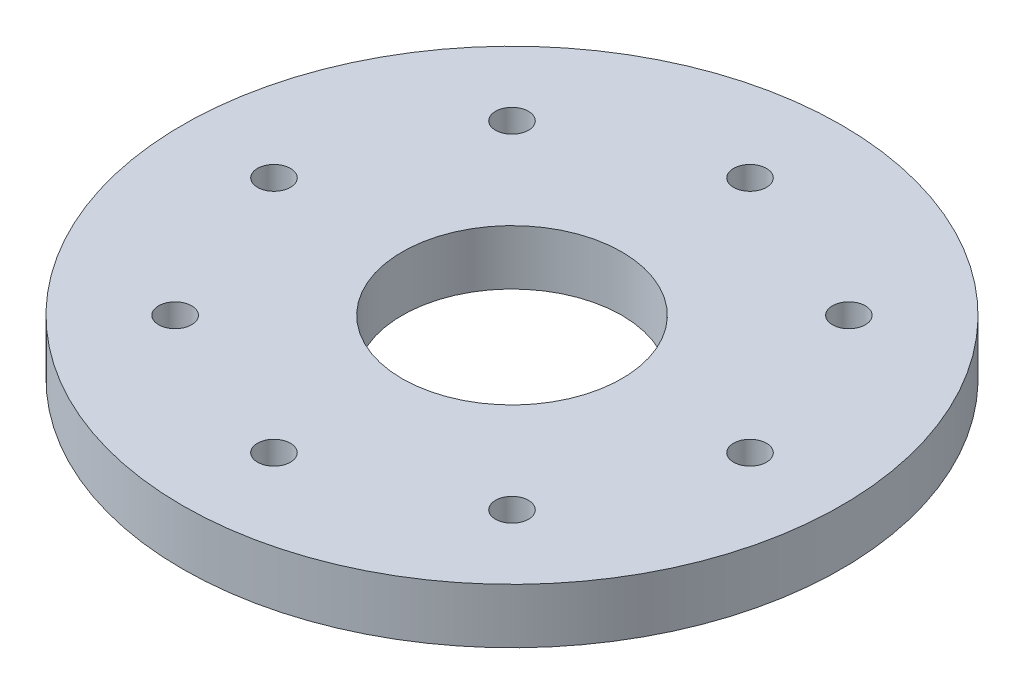
ISO-10303-21;
HEADER;
FILE_DESCRIPTION(('STEP AP214'),'2;1');
FILE_NAME('part.step','',(''),(''),'','','');
FILE_SCHEMA(('AUTOMOTIVE_DESIGN { 1 0 10303 214 1 1 1 1 }'));
ENDSEC;
DATA;
#1=APPLICATION_CONTEXT('core data for automotive mechanical design processes');
#2=APPLICATION_PROTOCOL_DEFINITION('international standard','automotive_design',2000,#1);
#3=PRODUCT_CONTEXT('',#1,'mechanical');
#4=PRODUCT('Part','Part','',(#3));
#5=PRODUCT_RELATED_PRODUCT_CATEGORY('part','',(#4));
#6=PRODUCT_DEFINITION_FORMATION('','',#4);
#7=PRODUCT_DEFINITION_CONTEXT('part definition',#1,'design');
#8=PRODUCT_DEFINITION('design','',#6,#7);
#9=PRODUCT_DEFINITION_SHAPE('','',#8);
#10=(LENGTH_UNIT() NAMED_UNIT(*) SI_UNIT(.MILLI.,.METRE.));
#11=(NAMED_UNIT(*) PLANE_ANGLE_UNIT() SI_UNIT($,.RADIAN.));
#12=(NAMED_UNIT(*) SI_UNIT($,.STERADIAN.) SOLID_ANGLE_UNIT());
#13=UNCERTAINTY_MEASURE_WITH_UNIT(LENGTH_MEASURE(1.E-05),#10,'distance_accuracy_value','');
#14=(GEOMETRIC_REPRESENTATION_CONTEXT(3) GLOBAL_UNCERTAINTY_ASSIGNED_CONTEXT((#13)) GLOBAL_UNIT_ASSIGNED_CONTEXT((#10,
#11,#12)) REPRESENTATION_CONTEXT('',''));
#15=CARTESIAN_POINT('',(0.,0.,0.));
#16=DIRECTION('',(0.,0.,1.));
#17=DIRECTION('',(1.,0.,0.));
#18=AXIS2_PLACEMENT_3D('',#15,#16,#17);
#19=CARTESIAN_POINT('',(0.,30.,0.));
#20=DIRECTION('',(0.,1.,0.));
#21=DIRECTION('',(0.,0.,1.));
#22=AXIS2_PLACEMENT_3D('',#19,#20,#21);
#23=PLANE('',#22);
#24=CARTESIAN_POINT('',(92.,30.,92.));
#25=DIRECTION('',(0.,1.,0.));
#26=DIRECTION('',(0.,0.,1.));
#27=AXIS2_PLACEMENT_3D('',#24,#25,#26);
#28=CIRCLE('',#27,8.99999999999999);
#29=CARTESIAN_POINT('',(92.,30.,101.));
#30=VERTEX_POINT('',#29);
#31=EDGE_CURVE('E87',#30,#30,#28,.T.);
#32=ORIENTED_EDGE('',*,*,#31,.F.);
#33=EDGE_LOOP('',(#32));
#34=FACE_BOUND('',#33,.T.);
#35=CARTESIAN_POINT('',(92.,30.,-92.));
#36=DIRECTION('',(0.,1.,0.));
#37=DIRECTION('',(0.,0.,1.));
#38=AXIS2_PLACEMENT_3D('',#35,#36,#37);
#39=CIRCLE('',#38,8.99999999999999);
#40=CARTESIAN_POINT('',(92.,30.,-83.));
#41=VERTEX_POINT('',#40);
#42=EDGE_CURVE('E75',#41,#41,#39,.T.);
#43=ORIENTED_EDGE('',*,*,#42,.F.);
#44=EDGE_LOOP('',(#43));
#45=FACE_BOUND('',#44,.T.);
#46=CARTESIAN_POINT('',(0.,30.,-130.));
#47=DIRECTION('',(0.,1.,0.));
#48=DIRECTION('',(0.,0.,1.));
#49=AXIS2_PLACEMENT_3D('',#46,#47,#48);
#50=CIRCLE('',#49,9.);
#51=CARTESIAN_POINT('',(0.,30.,-121.));
#52=VERTEX_POINT('',#51);
#53=EDGE_CURVE('E63',#52,#52,#50,.T.);
#54=ORIENTED_EDGE('',*,*,#53,.F.);
#55=EDGE_LOOP('',(#54));
#56=FACE_BOUND('',#55,.T.);
#57=CARTESIAN_POINT('',(130.,30.,0.));
#58=DIRECTION('',(0.,1.,0.));
#59=DIRECTION('',(0.,0.,1.));
#60=AXIS2_PLACEMENT_3D('',#57,#58,#59);
#61=CIRCLE('',#60,9.00000000000001);
#62=CARTESIAN_POINT('',(130.,30.,9.00000000000001));
#63=VERTEX_POINT('',#62);
#64=EDGE_CURVE('E51',#63,#63,#61,.T.);
#65=ORIENTED_EDGE('',*,*,#64,.F.);
#66=EDGE_LOOP('',(#65));
#67=FACE_BOUND('',#66,.T.);
#68=CARTESIAN_POINT('',(0.,30.,0.));
#69=DIRECTION('',(0.,1.,0.));
#70=DIRECTION('',(0.,0.,1.));
#71=AXIS2_PLACEMENT_3D('',#68,#69,#70);
#72=CIRCLE('',#71,180.);
#73=CARTESIAN_POINT('',(0.,30.,180.));
#74=VERTEX_POINT('',#73);
#75=EDGE_CURVE('E10',#74,#74,#72,.T.);
#76=ORIENTED_EDGE('',*,*,#75,.T.);
#77=EDGE_LOOP('',(#76));
#78=FACE_BOUND('',#77,.T.);
#79=CARTESIAN_POINT('',(0.,30.,0.));
#80=DIRECTION('',(0.,1.,0.));
#81=DIRECTION('',(0.,0.,1.));
#82=AXIS2_PLACEMENT_3D('',#79,#80,#81);
#83=CIRCLE('',#82,60.);
#84=CARTESIAN_POINT('',(0.,30.,60.));
#85=VERTEX_POINT('',#84);
#86=EDGE_CURVE('E46',#85,#85,#83,.T.);
#87=ORIENTED_EDGE('',*,*,#86,.F.);
#88=EDGE_LOOP('',(#87));
#89=FACE_BOUND('',#88,.T.);
#90=CARTESIAN_POINT('',(-130.,30.,0.));
#91=DIRECTION('',(0.,1.,0.));
#92=DIRECTION('',(0.,0.,1.));
#93=AXIS2_PLACEMENT_3D('',#90,#91,#92);
#94=CIRCLE('',#93,9.);
#95=CARTESIAN_POINT('',(-130.,30.,9.));
#96=VERTEX_POINT('',#95);
#97=EDGE_CURVE('E57',#96,#96,#94,.T.);
#98=ORIENTED_EDGE('',*,*,#97,.F.);
#99=EDGE_LOOP('',(#98));
#100=FACE_BOUND('',#99,.T.);
#101=CARTESIAN_POINT('',(0.,30.,130.));
#102=DIRECTION('',(0.,1.,0.));
#103=DIRECTION('',(0.,0.,1.));
#104=AXIS2_PLACEMENT_3D('',#101,#102,#103);
#105=CIRCLE('',#104,9.);
#106=CARTESIAN_POINT('',(0.,30.,139.));
#107=VERTEX_POINT('',#106);
#108=EDGE_CURVE('E69',#107,#107,#105,.T.);
#109=ORIENTED_EDGE('',*,*,#108,.F.);
#110=EDGE_LOOP('',(#109));
#111=FACE_BOUND('',#110,.T.);
#112=CARTESIAN_POINT('',(-92.,30.,-92.));
#113=DIRECTION('',(0.,1.,0.));
#114=DIRECTION('',(0.,0.,1.));
#115=AXIS2_PLACEMENT_3D('',#112,#113,#114);
#116=CIRCLE('',#115,8.99999999999999);
#117=CARTESIAN_POINT('',(-92.,30.,-83.));
#118=VERTEX_POINT('',#117);
#119=EDGE_CURVE('E81',#118,#118,#116,.T.);
#120=ORIENTED_EDGE('',*,*,#119,.F.);
#121=EDGE_LOOP('',(#120));
#122=FACE_BOUND('',#121,.T.);
#123=CARTESIAN_POINT('',(-92.,30.,92.));
#124=DIRECTION('',(0.,1.,0.));
#125=DIRECTION('',(0.,0.,1.));
#126=AXIS2_PLACEMENT_3D('',#123,#124,#125);
#127=CIRCLE('',#126,8.99999999999999);
#128=CARTESIAN_POINT('',(-92.,30.,101.));
#129=VERTEX_POINT('',#128);
#130=EDGE_CURVE('E93',#129,#129,#127,.T.);
#131=ORIENTED_EDGE('',*,*,#130,.F.);
#132=EDGE_LOOP('',(#131));
#133=FACE_BOUND('',#132,.T.);
#134=ADVANCED_FACE('F35',(#34,#45,#56,#67,#78,#89,#100,#111,#122,#133),#23,.T.);
#135=CARTESIAN_POINT('',(0.,0.,0.));
#136=DIRECTION('',(0.,1.,0.));
#137=DIRECTION('',(0.,0.,1.));
#138=AXIS2_PLACEMENT_3D('',#135,#136,#137);
#139=PLANE('',#138);
#140=CARTESIAN_POINT('',(0.,0.,0.));
#141=DIRECTION('',(0.,1.,0.));
#142=DIRECTION('',(0.,0.,1.));
#143=AXIS2_PLACEMENT_3D('',#140,#141,#142);
#144=CIRCLE('',#143,180.);
#145=CARTESIAN_POINT('',(0.,0.,180.));
#146=VERTEX_POINT('',#145);
#147=EDGE_CURVE('E39',#146,#146,#144,.T.);
#148=ORIENTED_EDGE('',*,*,#147,.F.);
#149=EDGE_LOOP('',(#148));
#150=FACE_BOUND('',#149,.T.);
#151=CARTESIAN_POINT('',(0.,0.,0.));
#152=DIRECTION('',(0.,1.,0.));
#153=DIRECTION('',(0.,0.,1.));
#154=AXIS2_PLACEMENT_3D('',#151,#152,#153);
#155=CIRCLE('',#154,60.);
#156=CARTESIAN_POINT('',(0.,0.,60.));
#157=VERTEX_POINT('',#156);
#158=EDGE_CURVE('E48',#157,#157,#155,.T.);
#159=ORIENTED_EDGE('',*,*,#158,.T.);
#160=EDGE_LOOP('',(#159));
#161=FACE_BOUND('',#160,.T.);
#162=CARTESIAN_POINT('',(130.,0.,0.));
#163=DIRECTION('',(0.,1.,0.));
#164=DIRECTION('',(0.,0.,1.));
#165=AXIS2_PLACEMENT_3D('',#162,#163,#164);
#166=CIRCLE('',#165,9.00000000000001);
#167=CARTESIAN_POINT('',(130.,0.,9.00000000000001));
#168=VERTEX_POINT('',#167);
#169=EDGE_CURVE('E54',#168,#168,#166,.T.);
#170=ORIENTED_EDGE('',*,*,#169,.T.);
#171=EDGE_LOOP('',(#170));
#172=FACE_BOUND('',#171,.T.);
#173=CARTESIAN_POINT('',(-130.,0.,0.));
#174=DIRECTION('',(0.,1.,0.));
#175=DIRECTION('',(0.,0.,1.));
#176=AXIS2_PLACEMENT_3D('',#173,#174,#175);
#177=CIRCLE('',#176,9.);
#178=CARTESIAN_POINT('',(-130.,0.,9.));
#179=VERTEX_POINT('',#178);
#180=EDGE_CURVE('E60',#179,#179,#177,.T.);
#181=ORIENTED_EDGE('',*,*,#180,.T.);
#182=EDGE_LOOP('',(#181));
#183=FACE_BOUND('',#182,.T.);
#184=CARTESIAN_POINT('',(0.,0.,-130.));
#185=DIRECTION('',(0.,1.,0.));
#186=DIRECTION('',(0.,0.,1.));
#187=AXIS2_PLACEMENT_3D('',#184,#185,#186);
#188=CIRCLE('',#187,9.);
#189=CARTESIAN_POINT('',(0.,0.,-121.));
#190=VERTEX_POINT('',#189);
#191=EDGE_CURVE('E66',#190,#190,#188,.T.);
#192=ORIENTED_EDGE('',*,*,#191,.T.);
#193=EDGE_LOOP('',(#192));
#194=FACE_BOUND('',#193,.T.);
#195=CARTESIAN_POINT('',(0.,0.,130.));
#196=DIRECTION('',(0.,1.,0.));
#197=DIRECTION('',(0.,0.,1.));
#198=AXIS2_PLACEMENT_3D('',#195,#196,#197);
#199=CIRCLE('',#198,9.);
#200=CARTESIAN_POINT('',(0.,0.,139.));
#201=VERTEX_POINT('',#200);
#202=EDGE_CURVE('E72',#201,#201,#199,.T.);
#203=ORIENTED_EDGE('',*,*,#202,.T.);
#204=EDGE_LOOP('',(#203));
#205=FACE_BOUND('',#204,.T.);
#206=CARTESIAN_POINT('',(92.,0.,-92.));
#207=DIRECTION('',(0.,1.,0.));
#208=DIRECTION('',(0.,0.,1.));
#209=AXIS2_PLACEMENT_3D('',#206,#207,#208);
#210=CIRCLE('',#209,8.99999999999999);
#211=CARTESIAN_POINT('',(92.,0.,-83.));
#212=VERTEX_POINT('',#211);
#213=EDGE_CURVE('E78',#212,#212,#210,.T.);
#214=ORIENTED_EDGE('',*,*,#213,.T.);
#215=EDGE_LOOP('',(#214));
#216=FACE_BOUND('',#215,.T.);
#217=CARTESIAN_POINT('',(-92.,0.,-92.));
#218=DIRECTION('',(0.,1.,0.));
#219=DIRECTION('',(0.,0.,1.));
#220=AXIS2_PLACEMENT_3D('',#217,#218,#219);
#221=CIRCLE('',#220,8.99999999999999);
#222=CARTESIAN_POINT('',(-92.,0.,-83.));
#223=VERTEX_POINT('',#222);
#224=EDGE_CURVE('E84',#223,#223,#221,.T.);
#225=ORIENTED_EDGE('',*,*,#224,.T.);
#226=EDGE_LOOP('',(#225));
#227=FACE_BOUND('',#226,.T.);
#228=CARTESIAN_POINT('',(92.,0.,92.));
#229=DIRECTION('',(0.,1.,0.));
#230=DIRECTION('',(0.,0.,1.));
#231=AXIS2_PLACEMENT_3D('',#228,#229,#230);
#232=CIRCLE('',#231,8.99999999999999);
#233=CARTESIAN_POINT('',(92.,0.,101.));
#234=VERTEX_POINT('',#233);
#235=EDGE_CURVE('E90',#234,#234,#232,.T.);
#236=ORIENTED_EDGE('',*,*,#235,.T.);
#237=EDGE_LOOP('',(#236));
#238=FACE_BOUND('',#237,.T.);
#239=CARTESIAN_POINT('',(-92.,0.,92.));
#240=DIRECTION('',(0.,1.,0.));
#241=DIRECTION('',(0.,0.,1.));
#242=AXIS2_PLACEMENT_3D('',#239,#240,#241);
#243=CIRCLE('',#242,8.99999999999999);
#244=CARTESIAN_POINT('',(-92.,0.,101.));
#245=VERTEX_POINT('',#244);
#246=EDGE_CURVE('E96',#245,#245,#243,.T.);
#247=ORIENTED_EDGE('',*,*,#246,.T.);
#248=EDGE_LOOP('',(#247));
#249=FACE_BOUND('',#248,.T.);
#250=ADVANCED_FACE('F106',(#150,#161,#172,#183,#194,#205,#216,#227,#238,#249),#139,.F.);
#251=CARTESIAN_POINT('',(0.,30.,0.));
#252=DIRECTION('',(0.,-1.,0.));
#253=DIRECTION('',(0.,0.,-1.));
#254=AXIS2_PLACEMENT_3D('',#251,#252,#253);
#255=CYLINDRICAL_SURFACE('',#254,180.);
#256=ORIENTED_EDGE('',*,*,#75,.F.);
#257=EDGE_LOOP('',(#256));
#258=FACE_BOUND('',#257,.T.);
#259=ORIENTED_EDGE('',*,*,#147,.T.);
#260=EDGE_LOOP('',(#259));
#261=FACE_BOUND('',#260,.T.);
#262=ADVANCED_FACE('F37',(#258,#261),#255,.T.);
#263=CARTESIAN_POINT('',(0.,30.,0.));
#264=DIRECTION('',(0.,-1.,0.));
#265=DIRECTION('',(0.,0.,-1.));
#266=AXIS2_PLACEMENT_3D('',#263,#264,#265);
#267=CYLINDRICAL_SURFACE('',#266,60.);
#268=ORIENTED_EDGE('',*,*,#86,.T.);
#269=EDGE_LOOP('',(#268));
#270=FACE_BOUND('',#269,.T.);
#271=ORIENTED_EDGE('',*,*,#158,.F.);
#272=EDGE_LOOP('',(#271));
#273=FACE_BOUND('',#272,.T.);
#274=ADVANCED_FACE('F116',(#270,#273),#267,.F.);
#275=CARTESIAN_POINT('',(130.,30.,0.));
#276=DIRECTION('',(0.,-1.,0.));
#277=DIRECTION('',(0.,0.,-1.));
#278=AXIS2_PLACEMENT_3D('',#275,#276,#277);
#279=CYLINDRICAL_SURFACE('',#278,9.00000000000001);
#280=ORIENTED_EDGE('',*,*,#64,.T.);
#281=EDGE_LOOP('',(#280));
#282=FACE_BOUND('',#281,.T.);
#283=ORIENTED_EDGE('',*,*,#169,.F.);
#284=EDGE_LOOP('',(#283));
#285=FACE_BOUND('',#284,.T.);
#286=ADVANCED_FACE('F119',(#282,#285),#279,.F.);
#287=CARTESIAN_POINT('',(-130.,30.,0.));
#288=DIRECTION('',(0.,-1.,0.));
#289=DIRECTION('',(0.,0.,-1.));
#290=AXIS2_PLACEMENT_3D('',#287,#288,#289);
#291=CYLINDRICAL_SURFACE('',#290,9.);
#292=ORIENTED_EDGE('',*,*,#97,.T.);
#293=EDGE_LOOP('',(#292));
#294=FACE_BOUND('',#293,.T.);
#295=ORIENTED_EDGE('',*,*,#180,.F.);
#296=EDGE_LOOP('',(#295));
#297=FACE_BOUND('',#296,.T.);
#298=ADVANCED_FACE('F123',(#294,#297),#291,.F.);
#299=CARTESIAN_POINT('',(0.,30.,-130.));
#300=DIRECTION('',(0.,-1.,0.));
#301=DIRECTION('',(0.,0.,-1.));
#302=AXIS2_PLACEMENT_3D('',#299,#300,#301);
#303=CYLINDRICAL_SURFACE('',#302,9.);
#304=ORIENTED_EDGE('',*,*,#53,.T.);
#305=EDGE_LOOP('',(#304));
#306=FACE_BOUND('',#305,.T.);
#307=ORIENTED_EDGE('',*,*,#191,.F.);
#308=EDGE_LOOP('',(#307));
#309=FACE_BOUND('',#308,.T.);
#310=ADVANCED_FACE('F127',(#306,#309),#303,.F.);
#311=CARTESIAN_POINT('',(0.,30.,130.));
#312=DIRECTION('',(0.,-1.,0.));
#313=DIRECTION('',(0.,0.,-1.));
#314=AXIS2_PLACEMENT_3D('',#311,#312,#313);
#315=CYLINDRICAL_SURFACE('',#314,9.);
#316=ORIENTED_EDGE('',*,*,#108,.T.);
#317=EDGE_LOOP('',(#316));
#318=FACE_BOUND('',#317,.T.);
#319=ORIENTED_EDGE('',*,*,#202,.F.);
#320=EDGE_LOOP('',(#319));
#321=FACE_BOUND('',#320,.T.);
#322=ADVANCED_FACE('F131',(#318,#321),#315,.F.);
#323=CARTESIAN_POINT('',(92.,30.,-92.));
#324=DIRECTION('',(0.,-1.,0.));
#325=DIRECTION('',(0.,0.,-1.));
#326=AXIS2_PLACEMENT_3D('',#323,#324,#325);
#327=CYLINDRICAL_SURFACE('',#326,8.99999999999999);
#328=ORIENTED_EDGE('',*,*,#42,.T.);
#329=EDGE_LOOP('',(#328));
#330=FACE_BOUND('',#329,.T.);
#331=ORIENTED_EDGE('',*,*,#213,.F.);
#332=EDGE_LOOP('',(#331));
#333=FACE_BOUND('',#332,.T.);
#334=ADVANCED_FACE('F135',(#330,#333),#327,.F.);
#335=CARTESIAN_POINT('',(-92.,30.,-92.));
#336=DIRECTION('',(0.,-1.,0.));
#337=DIRECTION('',(0.,0.,-1.));
#338=AXIS2_PLACEMENT_3D('',#335,#336,#337);
#339=CYLINDRICAL_SURFACE('',#338,8.99999999999999);
#340=ORIENTED_EDGE('',*,*,#119,.T.);
#341=EDGE_LOOP('',(#340));
#342=FACE_BOUND('',#341,.T.);
#343=ORIENTED_EDGE('',*,*,#224,.F.);
#344=EDGE_LOOP('',(#343));
#345=FACE_BOUND('',#344,.T.);
#346=ADVANCED_FACE('F139',(#342,#345),#339,.F.);
#347=CARTESIAN_POINT('',(92.,30.,92.));
#348=DIRECTION('',(0.,-1.,0.));
#349=DIRECTION('',(0.,0.,-1.));
#350=AXIS2_PLACEMENT_3D('',#347,#348,#349);
#351=CYLINDRICAL_SURFACE('',#350,8.99999999999999);
#352=ORIENTED_EDGE('',*,*,#31,.T.);
#353=EDGE_LOOP('',(#352));
#354=FACE_BOUND('',#353,.T.);
#355=ORIENTED_EDGE('',*,*,#235,.F.);
#356=EDGE_LOOP('',(#355));
#357=FACE_BOUND('',#356,.T.);
#358=ADVANCED_FACE('F143',(#354,#357),#351,.F.);
#359=CARTESIAN_POINT('',(-92.,30.,92.));
#360=DIRECTION('',(0.,-1.,0.));
#361=DIRECTION('',(0.,0.,-1.));
#362=AXIS2_PLACEMENT_3D('',#359,#360,#361);
#363=CYLINDRICAL_SURFACE('',#362,8.99999999999999);
#364=ORIENTED_EDGE('',*,*,#130,.T.);
#365=EDGE_LOOP('',(#364));
#366=FACE_BOUND('',#365,.T.);
#367=ORIENTED_EDGE('',*,*,#246,.F.);
#368=EDGE_LOOP('',(#367));
#369=FACE_BOUND('',#368,.T.);
#370=ADVANCED_FACE('F102',(#366,#369),#363,.F.);
#371=CLOSED_SHELL('',(#134,#250,#262,#274,#286,#298,#310,#322,#334,#346,#358,#370));
#372=MANIFOLD_SOLID_BREP('B2',#371);
#373=ADVANCED_BREP_SHAPE_REPRESENTATION('',(#18,#372),#14);
#374=SHAPE_DEFINITION_REPRESENTATION(#9,#373);
ENDSEC;
END-ISO-10303-21;
